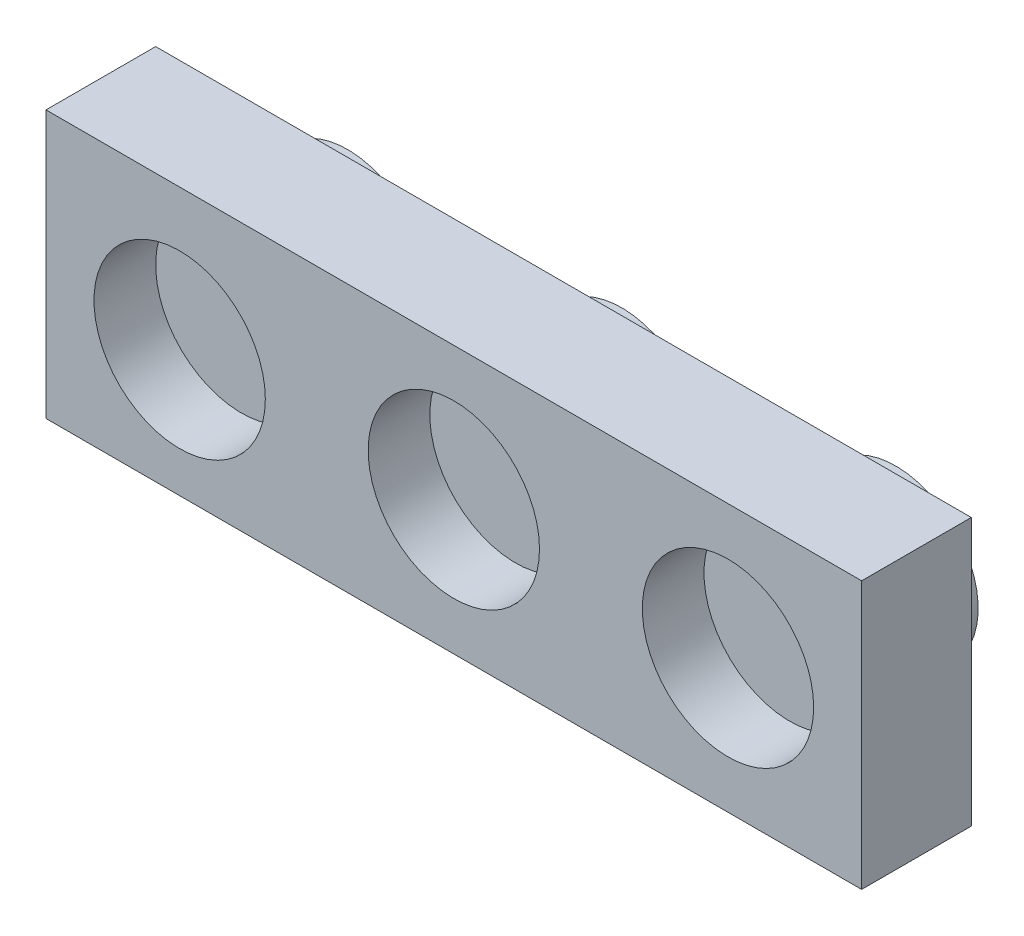
ISO-10303-21;
HEADER;
FILE_DESCRIPTION(('STEP AP214'),'2;1');
FILE_NAME('part.step','',(''),(''),'','','');
FILE_SCHEMA(('AUTOMOTIVE_DESIGN { 1 0 10303 214 1 1 1 1 }'));
ENDSEC;
DATA;
#1=APPLICATION_CONTEXT('core data for automotive mechanical design processes');
#2=APPLICATION_PROTOCOL_DEFINITION('international standard','automotive_design',2000,#1);
#3=PRODUCT_CONTEXT('',#1,'mechanical');
#4=PRODUCT('Part','Part','',(#3));
#5=PRODUCT_RELATED_PRODUCT_CATEGORY('part','',(#4));
#6=PRODUCT_DEFINITION_FORMATION('','',#4);
#7=PRODUCT_DEFINITION_CONTEXT('part definition',#1,'design');
#8=PRODUCT_DEFINITION('design','',#6,#7);
#9=PRODUCT_DEFINITION_SHAPE('','',#8);
#10=(LENGTH_UNIT() NAMED_UNIT(*) SI_UNIT(.MILLI.,.METRE.));
#11=(NAMED_UNIT(*) PLANE_ANGLE_UNIT() SI_UNIT($,.RADIAN.));
#12=(NAMED_UNIT(*) SI_UNIT($,.STERADIAN.) SOLID_ANGLE_UNIT());
#13=UNCERTAINTY_MEASURE_WITH_UNIT(LENGTH_MEASURE(1.E-05),#10,'distance_accuracy_value','');
#14=(GEOMETRIC_REPRESENTATION_CONTEXT(3) GLOBAL_UNCERTAINTY_ASSIGNED_CONTEXT((#13)) GLOBAL_UNIT_ASSIGNED_CONTEXT((#10,
#11,#12)) REPRESENTATION_CONTEXT('',''));
#15=CARTESIAN_POINT('',(0.,0.,0.));
#16=DIRECTION('',(0.,0.,1.));
#17=DIRECTION('',(1.,0.,0.));
#18=AXIS2_PLACEMENT_3D('',#15,#16,#17);
#19=CARTESIAN_POINT('',(11.9,-3.9,3.2));
#20=DIRECTION('',(-1.,0.,0.));
#21=DIRECTION('',(0.,0.,1.));
#22=AXIS2_PLACEMENT_3D('',#19,#20,#21);
#23=PLANE('',#22);
#24=DIRECTION('',(0.,1.,0.));
#25=VECTOR('',#24,1.);
#26=CARTESIAN_POINT('',(11.9,-3.9,0.));
#27=LINE('',#26,#25);
#28=CARTESIAN_POINT('',(11.9,-3.9,0.));
#29=VERTEX_POINT('',#28);
#30=CARTESIAN_POINT('',(11.9,3.9,0.));
#31=VERTEX_POINT('',#30);
#32=EDGE_CURVE('E101',#29,#31,#27,.T.);
#33=ORIENTED_EDGE('',*,*,#32,.T.);
#34=DIRECTION('',(0.,0.,-1.));
#35=VECTOR('',#34,1.);
#36=CARTESIAN_POINT('',(11.9,3.9,3.2));
#37=LINE('',#36,#35);
#38=CARTESIAN_POINT('',(11.9,3.9,3.2));
#39=VERTEX_POINT('',#38);
#40=EDGE_CURVE('E38',#39,#31,#37,.T.);
#41=ORIENTED_EDGE('',*,*,#40,.F.);
#42=DIRECTION('',(0.,1.,0.));
#43=VECTOR('',#42,1.);
#44=CARTESIAN_POINT('',(11.9,-3.9,3.2));
#45=LINE('',#44,#43);
#46=CARTESIAN_POINT('',(11.9,-3.9,3.2));
#47=VERTEX_POINT('',#46);
#48=EDGE_CURVE('E88',#47,#39,#45,.T.);
#49=ORIENTED_EDGE('',*,*,#48,.F.);
#50=DIRECTION('',(0.,0.,-1.));
#51=VECTOR('',#50,1.);
#52=CARTESIAN_POINT('',(11.9,-3.9,3.2));
#53=LINE('',#52,#51);
#54=EDGE_CURVE('E97',#47,#29,#53,.T.);
#55=ORIENTED_EDGE('',*,*,#54,.T.);
#56=EDGE_LOOP('',(#33,#41,#49,#55));
#57=FACE_BOUND('',#56,.T.);
#58=ADVANCED_FACE('F35',(#57),#23,.F.);
#59=CARTESIAN_POINT('',(-11.9,3.9,3.2));
#60=DIRECTION('',(0.,-1.,0.));
#61=DIRECTION('',(0.,0.,-1.));
#62=AXIS2_PLACEMENT_3D('',#59,#60,#61);
#63=PLANE('',#62);
#64=DIRECTION('',(-1.,0.,0.));
#65=VECTOR('',#64,1.);
#66=CARTESIAN_POINT('',(-11.9,3.9,0.));
#67=LINE('',#66,#65);
#68=CARTESIAN_POINT('',(-11.9,3.9,0.));
#69=VERTEX_POINT('',#68);
#70=EDGE_CURVE('E93',#31,#69,#67,.T.);
#71=ORIENTED_EDGE('',*,*,#70,.T.);
#72=DIRECTION('',(0.,0.,-1.));
#73=VECTOR('',#72,1.);
#74=CARTESIAN_POINT('',(-11.9,3.9,3.2));
#75=LINE('',#74,#73);
#76=CARTESIAN_POINT('',(-11.9,3.9,3.2));
#77=VERTEX_POINT('',#76);
#78=EDGE_CURVE('E91',#77,#69,#75,.T.);
#79=ORIENTED_EDGE('',*,*,#78,.F.);
#80=DIRECTION('',(-1.,0.,0.));
#81=VECTOR('',#80,1.);
#82=CARTESIAN_POINT('',(-11.9,3.9,3.2));
#83=LINE('',#82,#81);
#84=EDGE_CURVE('E83',#39,#77,#83,.T.);
#85=ORIENTED_EDGE('',*,*,#84,.F.);
#86=ORIENTED_EDGE('',*,*,#40,.T.);
#87=EDGE_LOOP('',(#71,#79,#85,#86));
#88=FACE_BOUND('',#87,.T.);
#89=ADVANCED_FACE('F92',(#88),#63,.F.);
#90=CARTESIAN_POINT('',(-11.9,-3.9,3.2));
#91=DIRECTION('',(1.,0.,0.));
#92=DIRECTION('',(0.,0.,-1.));
#93=AXIS2_PLACEMENT_3D('',#90,#91,#92);
#94=PLANE('',#93);
#95=DIRECTION('',(0.,-1.,0.));
#96=VECTOR('',#95,1.);
#97=CARTESIAN_POINT('',(-11.9,-3.9,0.));
#98=LINE('',#97,#96);
#99=CARTESIAN_POINT('',(-11.9,-3.9,0.));
#100=VERTEX_POINT('',#99);
#101=EDGE_CURVE('E69',#69,#100,#98,.T.);
#102=ORIENTED_EDGE('',*,*,#101,.T.);
#103=DIRECTION('',(0.,0.,-1.));
#104=VECTOR('',#103,1.);
#105=CARTESIAN_POINT('',(-11.9,-3.9,3.2));
#106=LINE('',#105,#104);
#107=CARTESIAN_POINT('',(-11.9,-3.9,3.2));
#108=VERTEX_POINT('',#107);
#109=EDGE_CURVE('E94',#108,#100,#106,.T.);
#110=ORIENTED_EDGE('',*,*,#109,.F.);
#111=DIRECTION('',(0.,-1.,0.));
#112=VECTOR('',#111,1.);
#113=CARTESIAN_POINT('',(-11.9,-3.9,3.2));
#114=LINE('',#113,#112);
#115=EDGE_CURVE('E86',#77,#108,#114,.T.);
#116=ORIENTED_EDGE('',*,*,#115,.F.);
#117=ORIENTED_EDGE('',*,*,#78,.T.);
#118=EDGE_LOOP('',(#102,#110,#116,#117));
#119=FACE_BOUND('',#118,.T.);
#120=ADVANCED_FACE('F95',(#119),#94,.F.);
#121=CARTESIAN_POINT('',(-11.9,-3.9,3.2));
#122=DIRECTION('',(0.,1.,0.));
#123=DIRECTION('',(0.,0.,1.));
#124=AXIS2_PLACEMENT_3D('',#121,#122,#123);
#125=PLANE('',#124);
#126=DIRECTION('',(1.,0.,0.));
#127=VECTOR('',#126,1.);
#128=CARTESIAN_POINT('',(-11.9,-3.9,0.));
#129=LINE('',#128,#127);
#130=EDGE_CURVE('E75',#100,#29,#129,.T.);
#131=ORIENTED_EDGE('',*,*,#130,.T.);
#132=ORIENTED_EDGE('',*,*,#54,.F.);
#133=DIRECTION('',(1.,0.,0.));
#134=VECTOR('',#133,1.);
#135=CARTESIAN_POINT('',(-11.9,-3.9,3.2));
#136=LINE('',#135,#134);
#137=EDGE_CURVE('E52',#108,#47,#136,.T.);
#138=ORIENTED_EDGE('',*,*,#137,.F.);
#139=ORIENTED_EDGE('',*,*,#109,.T.);
#140=EDGE_LOOP('',(#131,#132,#138,#139));
#141=FACE_BOUND('',#140,.T.);
#142=ADVANCED_FACE('F109',(#141),#125,.F.);
#143=CARTESIAN_POINT('',(0.,0.,3.2));
#144=DIRECTION('',(0.,0.,-1.));
#145=DIRECTION('',(-1.,0.,0.));
#146=AXIS2_PLACEMENT_3D('',#143,#144,#145);
#147=PLANE('',#146);
#148=CARTESIAN_POINT('',(8.,0.,3.2));
#149=DIRECTION('',(0.,0.,1.));
#150=DIRECTION('',(1.,0.,0.));
#151=AXIS2_PLACEMENT_3D('',#148,#149,#150);
#152=CIRCLE('',#151,2.5);
#153=CARTESIAN_POINT('',(10.5,0.,3.2));
#154=VERTEX_POINT('',#153);
#155=EDGE_CURVE('E136',#154,#154,#152,.T.);
#156=ORIENTED_EDGE('',*,*,#155,.F.);
#157=EDGE_LOOP('',(#156));
#158=FACE_BOUND('',#157,.T.);
#159=CARTESIAN_POINT('',(-8.,-0.211129938597843,3.2));
#160=DIRECTION('',(0.,0.,1.));
#161=DIRECTION('',(1.,0.,0.));
#162=AXIS2_PLACEMENT_3D('',#159,#160,#161);
#163=CIRCLE('',#162,2.5);
#164=CARTESIAN_POINT('',(-5.5,-0.211129938597843,3.2));
#165=VERTEX_POINT('',#164);
#166=EDGE_CURVE('E142',#165,#165,#163,.T.);
#167=ORIENTED_EDGE('',*,*,#166,.F.);
#168=EDGE_LOOP('',(#167));
#169=FACE_BOUND('',#168,.T.);
#170=CARTESIAN_POINT('',(0.,0.,3.2));
#171=DIRECTION('',(0.,0.,1.));
#172=DIRECTION('',(1.,0.,0.));
#173=AXIS2_PLACEMENT_3D('',#170,#171,#172);
#174=CIRCLE('',#173,2.5);
#175=CARTESIAN_POINT('',(2.5,0.,3.2));
#176=VERTEX_POINT('',#175);
#177=EDGE_CURVE('E130',#176,#176,#174,.T.);
#178=ORIENTED_EDGE('',*,*,#177,.F.);
#179=EDGE_LOOP('',(#178));
#180=FACE_BOUND('',#179,.T.);
#181=ORIENTED_EDGE('',*,*,#48,.T.);
#182=ORIENTED_EDGE('',*,*,#84,.T.);
#183=ORIENTED_EDGE('',*,*,#115,.T.);
#184=ORIENTED_EDGE('',*,*,#137,.T.);
#185=EDGE_LOOP('',(#181,#182,#183,#184));
#186=FACE_BOUND('',#185,.T.);
#187=ADVANCED_FACE('F84',(#158,#169,#180,#186),#147,.F.);
#188=CARTESIAN_POINT('',(0.,0.,0.));
#189=DIRECTION('',(0.,0.,-1.));
#190=DIRECTION('',(-1.,0.,0.));
#191=AXIS2_PLACEMENT_3D('',#188,#189,#190);
#192=PLANE('',#191);
#193=CARTESIAN_POINT('',(8.,0.,0.));
#194=DIRECTION('',(0.,0.,-1.));
#195=DIRECTION('',(-1.,0.,0.));
#196=AXIS2_PLACEMENT_3D('',#193,#194,#195);
#197=CIRCLE('',#196,2.4);
#198=CARTESIAN_POINT('',(5.6,0.,0.));
#199=VERTEX_POINT('',#198);
#200=EDGE_CURVE('E124',#199,#199,#197,.T.);
#201=ORIENTED_EDGE('',*,*,#200,.F.);
#202=EDGE_LOOP('',(#201));
#203=FACE_BOUND('',#202,.T.);
#204=CARTESIAN_POINT('',(-8.,0.,0.));
#205=DIRECTION('',(0.,0.,-1.));
#206=DIRECTION('',(-1.,0.,0.));
#207=AXIS2_PLACEMENT_3D('',#204,#205,#206);
#208=CIRCLE('',#207,2.4);
#209=CARTESIAN_POINT('',(-10.4,0.,0.));
#210=VERTEX_POINT('',#209);
#211=EDGE_CURVE('E118',#210,#210,#208,.T.);
#212=ORIENTED_EDGE('',*,*,#211,.F.);
#213=EDGE_LOOP('',(#212));
#214=FACE_BOUND('',#213,.T.);
#215=CARTESIAN_POINT('',(0.,0.,0.));
#216=DIRECTION('',(0.,0.,-1.));
#217=DIRECTION('',(-1.,0.,0.));
#218=AXIS2_PLACEMENT_3D('',#215,#216,#217);
#219=CIRCLE('',#218,2.4);
#220=CARTESIAN_POINT('',(-2.4,0.,0.));
#221=VERTEX_POINT('',#220);
#222=EDGE_CURVE('E11',#221,#221,#219,.T.);
#223=ORIENTED_EDGE('',*,*,#222,.F.);
#224=EDGE_LOOP('',(#223));
#225=FACE_BOUND('',#224,.T.);
#226=ORIENTED_EDGE('',*,*,#32,.F.);
#227=ORIENTED_EDGE('',*,*,#130,.F.);
#228=ORIENTED_EDGE('',*,*,#101,.F.);
#229=ORIENTED_EDGE('',*,*,#70,.F.);
#230=EDGE_LOOP('',(#226,#227,#228,#229));
#231=FACE_BOUND('',#230,.T.);
#232=ADVANCED_FACE('F112',(#203,#214,#225,#231),#192,.T.);
#233=CARTESIAN_POINT('',(0.,0.,-1.7));
#234=DIRECTION('',(0.,0.,1.));
#235=DIRECTION('',(1.,0.,0.));
#236=AXIS2_PLACEMENT_3D('',#233,#234,#235);
#237=CYLINDRICAL_SURFACE('',#236,2.4);
#238=CARTESIAN_POINT('',(0.,0.,-1.7));
#239=DIRECTION('',(0.,0.,-1.));
#240=DIRECTION('',(-1.,0.,0.));
#241=AXIS2_PLACEMENT_3D('',#238,#239,#240);
#242=CIRCLE('',#241,2.4);
#243=CARTESIAN_POINT('',(-2.4,0.,-1.7));
#244=VERTEX_POINT('',#243);
#245=EDGE_CURVE('E104',#244,#244,#242,.T.);
#246=ORIENTED_EDGE('',*,*,#245,.F.);
#247=EDGE_LOOP('',(#246));
#248=FACE_BOUND('',#247,.T.);
#249=ORIENTED_EDGE('',*,*,#222,.T.);
#250=EDGE_LOOP('',(#249));
#251=FACE_BOUND('',#250,.T.);
#252=ADVANCED_FACE('F190',(#248,#251),#237,.T.);
#253=CARTESIAN_POINT('',(0.,0.,-1.7));
#254=DIRECTION('',(0.,0.,-1.));
#255=DIRECTION('',(-1.,0.,0.));
#256=AXIS2_PLACEMENT_3D('',#253,#254,#255);
#257=PLANE('',#256);
#258=ORIENTED_EDGE('',*,*,#245,.T.);
#259=EDGE_LOOP('',(#258));
#260=FACE_BOUND('',#259,.T.);
#261=ADVANCED_FACE('F195',(#260),#257,.T.);
#262=CARTESIAN_POINT('',(-8.,0.,-1.7));
#263=DIRECTION('',(0.,0.,1.));
#264=DIRECTION('',(1.,0.,0.));
#265=AXIS2_PLACEMENT_3D('',#262,#263,#264);
#266=CYLINDRICAL_SURFACE('',#265,2.4);
#267=CARTESIAN_POINT('',(-8.,0.,-1.7));
#268=DIRECTION('',(0.,0.,-1.));
#269=DIRECTION('',(-1.,0.,0.));
#270=AXIS2_PLACEMENT_3D('',#267,#268,#269);
#271=CIRCLE('',#270,2.4);
#272=CARTESIAN_POINT('',(-10.4,0.,-1.7));
#273=VERTEX_POINT('',#272);
#274=EDGE_CURVE('E117',#273,#273,#271,.T.);
#275=ORIENTED_EDGE('',*,*,#274,.F.);
#276=EDGE_LOOP('',(#275));
#277=FACE_BOUND('',#276,.T.);
#278=ORIENTED_EDGE('',*,*,#211,.T.);
#279=EDGE_LOOP('',(#278));
#280=FACE_BOUND('',#279,.T.);
#281=ADVANCED_FACE('F199',(#277,#280),#266,.T.);
#282=CARTESIAN_POINT('',(-8.,0.,-1.7));
#283=DIRECTION('',(0.,0.,-1.));
#284=DIRECTION('',(-1.,0.,0.));
#285=AXIS2_PLACEMENT_3D('',#282,#283,#284);
#286=PLANE('',#285);
#287=ORIENTED_EDGE('',*,*,#274,.T.);
#288=EDGE_LOOP('',(#287));
#289=FACE_BOUND('',#288,.T.);
#290=ADVANCED_FACE('F203',(#289),#286,.T.);
#291=CARTESIAN_POINT('',(8.,0.,-1.7));
#292=DIRECTION('',(0.,0.,1.));
#293=DIRECTION('',(1.,0.,0.));
#294=AXIS2_PLACEMENT_3D('',#291,#292,#293);
#295=CYLINDRICAL_SURFACE('',#294,2.4);
#296=CARTESIAN_POINT('',(8.,0.,-1.7));
#297=DIRECTION('',(0.,0.,-1.));
#298=DIRECTION('',(-1.,0.,0.));
#299=AXIS2_PLACEMENT_3D('',#296,#297,#298);
#300=CIRCLE('',#299,2.4);
#301=CARTESIAN_POINT('',(5.6,0.,-1.7));
#302=VERTEX_POINT('',#301);
#303=EDGE_CURVE('E121',#302,#302,#300,.T.);
#304=ORIENTED_EDGE('',*,*,#303,.F.);
#305=EDGE_LOOP('',(#304));
#306=FACE_BOUND('',#305,.T.);
#307=ORIENTED_EDGE('',*,*,#200,.T.);
#308=EDGE_LOOP('',(#307));
#309=FACE_BOUND('',#308,.T.);
#310=ADVANCED_FACE('F174',(#306,#309),#295,.T.);
#311=CARTESIAN_POINT('',(8.,0.,-1.7));
#312=DIRECTION('',(0.,0.,-1.));
#313=DIRECTION('',(-1.,0.,0.));
#314=AXIS2_PLACEMENT_3D('',#311,#312,#313);
#315=PLANE('',#314);
#316=ORIENTED_EDGE('',*,*,#303,.T.);
#317=EDGE_LOOP('',(#316));
#318=FACE_BOUND('',#317,.T.);
#319=ADVANCED_FACE('F165',(#318),#315,.T.);
#320=CARTESIAN_POINT('',(0.,0.,1.4));
#321=DIRECTION('',(0.,0.,1.));
#322=DIRECTION('',(1.,0.,0.));
#323=AXIS2_PLACEMENT_3D('',#320,#321,#322);
#324=CYLINDRICAL_SURFACE('',#323,2.5);
#325=CARTESIAN_POINT('',(0.,0.,1.4));
#326=DIRECTION('',(0.,0.,1.));
#327=DIRECTION('',(1.,0.,0.));
#328=AXIS2_PLACEMENT_3D('',#325,#326,#327);
#329=CIRCLE('',#328,2.5);
#330=CARTESIAN_POINT('',(2.5,0.,1.4));
#331=VERTEX_POINT('',#330);
#332=EDGE_CURVE('E127',#331,#331,#329,.T.);
#333=ORIENTED_EDGE('',*,*,#332,.F.);
#334=EDGE_LOOP('',(#333));
#335=FACE_BOUND('',#334,.T.);
#336=ORIENTED_EDGE('',*,*,#177,.T.);
#337=EDGE_LOOP('',(#336));
#338=FACE_BOUND('',#337,.T.);
#339=ADVANCED_FACE('F163',(#335,#338),#324,.F.);
#340=CARTESIAN_POINT('',(0.,0.,1.4));
#341=DIRECTION('',(0.,0.,1.));
#342=DIRECTION('',(1.,0.,0.));
#343=AXIS2_PLACEMENT_3D('',#340,#341,#342);
#344=PLANE('',#343);
#345=ORIENTED_EDGE('',*,*,#332,.T.);
#346=EDGE_LOOP('',(#345));
#347=FACE_BOUND('',#346,.T.);
#348=ADVANCED_FACE('F153',(#347),#344,.T.);
#349=CARTESIAN_POINT('',(-8.,-0.211129938597843,1.4));
#350=DIRECTION('',(0.,0.,1.));
#351=DIRECTION('',(1.,0.,0.));
#352=AXIS2_PLACEMENT_3D('',#349,#350,#351);
#353=CYLINDRICAL_SURFACE('',#352,2.5);
#354=CARTESIAN_POINT('',(-8.,-0.211129938597843,1.4));
#355=DIRECTION('',(0.,0.,1.));
#356=DIRECTION('',(1.,0.,0.));
#357=AXIS2_PLACEMENT_3D('',#354,#355,#356);
#358=CIRCLE('',#357,2.5);
#359=CARTESIAN_POINT('',(-5.5,-0.211129938597843,1.4));
#360=VERTEX_POINT('',#359);
#361=EDGE_CURVE('E133',#360,#360,#358,.T.);
#362=ORIENTED_EDGE('',*,*,#361,.F.);
#363=EDGE_LOOP('',(#362));
#364=FACE_BOUND('',#363,.T.);
#365=ORIENTED_EDGE('',*,*,#166,.T.);
#366=EDGE_LOOP('',(#365));
#367=FACE_BOUND('',#366,.T.);
#368=ADVANCED_FACE('F150',(#364,#367),#353,.F.);
#369=CARTESIAN_POINT('',(-8.,-0.211129938597843,1.4));
#370=DIRECTION('',(0.,0.,1.));
#371=DIRECTION('',(1.,0.,0.));
#372=AXIS2_PLACEMENT_3D('',#369,#370,#371);
#373=PLANE('',#372);
#374=ORIENTED_EDGE('',*,*,#361,.T.);
#375=EDGE_LOOP('',(#374));
#376=FACE_BOUND('',#375,.T.);
#377=ADVANCED_FACE('F148',(#376),#373,.T.);
#378=CARTESIAN_POINT('',(8.,0.,1.4));
#379=DIRECTION('',(0.,0.,1.));
#380=DIRECTION('',(1.,0.,0.));
#381=AXIS2_PLACEMENT_3D('',#378,#379,#380);
#382=CYLINDRICAL_SURFACE('',#381,2.5);
#383=CARTESIAN_POINT('',(8.,0.,1.4));
#384=DIRECTION('',(0.,0.,1.));
#385=DIRECTION('',(1.,0.,0.));
#386=AXIS2_PLACEMENT_3D('',#383,#384,#385);
#387=CIRCLE('',#386,2.5);
#388=CARTESIAN_POINT('',(10.5,0.,1.4));
#389=VERTEX_POINT('',#388);
#390=EDGE_CURVE('E139',#389,#389,#387,.T.);
#391=ORIENTED_EDGE('',*,*,#390,.F.);
#392=EDGE_LOOP('',(#391));
#393=FACE_BOUND('',#392,.T.);
#394=ORIENTED_EDGE('',*,*,#155,.T.);
#395=EDGE_LOOP('',(#394));
#396=FACE_BOUND('',#395,.T.);
#397=ADVANCED_FACE('F260',(#393,#396),#382,.F.);
#398=CARTESIAN_POINT('',(8.,0.,1.4));
#399=DIRECTION('',(0.,0.,1.));
#400=DIRECTION('',(1.,0.,0.));
#401=AXIS2_PLACEMENT_3D('',#398,#399,#400);
#402=PLANE('',#401);
#403=ORIENTED_EDGE('',*,*,#390,.T.);
#404=EDGE_LOOP('',(#403));
#405=FACE_BOUND('',#404,.T.);
#406=ADVANCED_FACE('F269',(#405),#402,.T.);
#407=CLOSED_SHELL('',(#58,#89,#120,#142,#187,#232,#252,#261,#281,#290,#310,#319,#339,#348,#368,
#377,#397,#406));
#408=MANIFOLD_SOLID_BREP('B2',#407);
#409=ADVANCED_BREP_SHAPE_REPRESENTATION('',(#18,#408),#14);
#410=SHAPE_DEFINITION_REPRESENTATION(#9,#409);
ENDSEC;
END-ISO-10303-21;
